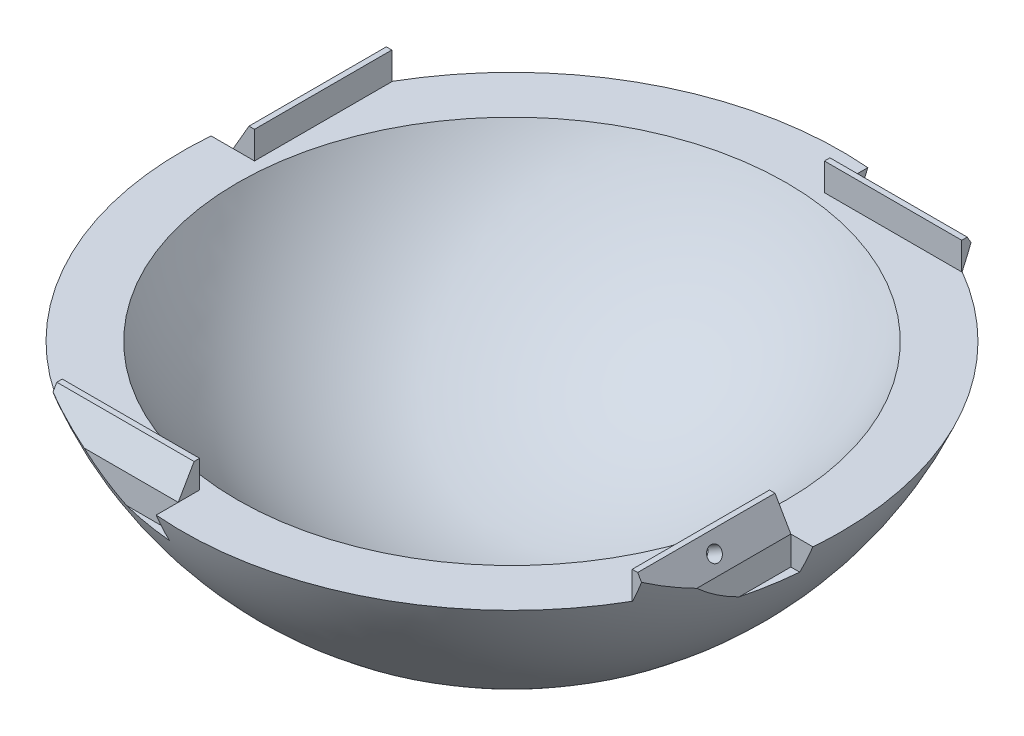
ISO-10303-21;
HEADER;
FILE_DESCRIPTION(('STEP AP214'),'2;1');
FILE_NAME('part.step','',(''),(''),'','','');
FILE_SCHEMA(('AUTOMOTIVE_DESIGN { 1 0 10303 214 1 1 1 1 }'));
ENDSEC;
DATA;
#1=APPLICATION_CONTEXT('core data for automotive mechanical design processes');
#2=APPLICATION_PROTOCOL_DEFINITION('international standard','automotive_design',2000,#1);
#3=PRODUCT_CONTEXT('',#1,'mechanical');
#4=PRODUCT('Part','Part','',(#3));
#5=PRODUCT_RELATED_PRODUCT_CATEGORY('part','',(#4));
#6=PRODUCT_DEFINITION_FORMATION('','',#4);
#7=PRODUCT_DEFINITION_CONTEXT('part definition',#1,'design');
#8=PRODUCT_DEFINITION('design','',#6,#7);
#9=PRODUCT_DEFINITION_SHAPE('','',#8);
#10=(LENGTH_UNIT() NAMED_UNIT(*) SI_UNIT(.MILLI.,.METRE.));
#11=(NAMED_UNIT(*) PLANE_ANGLE_UNIT() SI_UNIT($,.RADIAN.));
#12=(NAMED_UNIT(*) SI_UNIT($,.STERADIAN.) SOLID_ANGLE_UNIT());
#13=UNCERTAINTY_MEASURE_WITH_UNIT(LENGTH_MEASURE(1.E-05),#10,'distance_accuracy_value','');
#14=(GEOMETRIC_REPRESENTATION_CONTEXT(3) GLOBAL_UNCERTAINTY_ASSIGNED_CONTEXT((#13)) GLOBAL_UNIT_ASSIGNED_CONTEXT((#10,
#11,#12)) REPRESENTATION_CONTEXT('',''));
#15=CARTESIAN_POINT('',(0.,0.,0.));
#16=DIRECTION('',(0.,0.,1.));
#17=DIRECTION('',(1.,0.,0.));
#18=AXIS2_PLACEMENT_3D('',#15,#16,#17);
#19=CARTESIAN_POINT('',(0.,31.0836229548616,0.));
#20=DIRECTION('',(0.,1.,0.));
#21=DIRECTION('',(1.,0.,0.));
#22=AXIS2_PLACEMENT_3D('',#19,#20,#21);
#23=SPHERICAL_SURFACE('',#22,82.296);
#24=CARTESIAN_POINT('',(0.,0.,0.));
#25=DIRECTION('',(0.,1.,0.));
#26=DIRECTION('',(0.,0.,1.));
#27=AXIS2_PLACEMENT_3D('',#24,#25,#26);
#28=CIRCLE('',#27,76.2);
#29=CARTESIAN_POINT('',(-6.34999999999972,0.,75.9349557186939));
#30=VERTEX_POINT('',#29);
#31=CARTESIAN_POINT('',(65.9911357683742,0.,38.1));
#32=VERTEX_POINT('',#31);
#33=EDGE_CURVE('E413',#30,#32,#28,.T.);
#34=ORIENTED_EDGE('',*,*,#33,.F.);
#35=CARTESIAN_POINT('',(-6.34999999999998,31.0836229548616,0.));
#36=DIRECTION('',(-1.,0.,0.));
#37=DIRECTION('',(0.,0.,1.));
#38=AXIS2_PLACEMENT_3D('',#35,#36,#37);
#39=CIRCLE('',#38,82.0506496988293);
#40=CARTESIAN_POINT('',(-6.34999999999973,-6.604,72.8831406568912));
#41=VERTEX_POINT('',#40);
#42=EDGE_CURVE('E498',#30,#41,#39,.F.);
#43=ORIENTED_EDGE('',*,*,#42,.T.);
#44=CARTESIAN_POINT('',(0.,-6.604,0.));
#45=DIRECTION('',(0.,1.,0.));
#46=DIRECTION('',(0.,0.,1.));
#47=AXIS2_PLACEMENT_3D('',#44,#45,#46);
#48=CIRCLE('',#47,73.1592420136526);
#49=CARTESIAN_POINT('',(-18.3044560012823,-6.604,70.8323484187085));
#50=VERTEX_POINT('',#49);
#51=EDGE_CURVE('E495',#41,#50,#48,.F.);
#52=ORIENTED_EDGE('',*,*,#51,.T.);
#53=CARTESIAN_POINT('',(2.45406499722476E-13,31.0836229548616,70.8323484187084));
#54=DIRECTION('',(0.,0.,-1.));
#55=DIRECTION('',(-1.,0.,0.));
#56=AXIS2_PLACEMENT_3D('',#53,#54,#55);
#57=CIRCLE('',#56,41.8976136968528);
#58=CARTESIAN_POINT('',(-28.0930314756291,0.,70.8323484187085));
#59=VERTEX_POINT('',#58);
#60=EDGE_CURVE('E342',#59,#50,#57,.F.);
#61=ORIENTED_EDGE('',*,*,#60,.F.);
#62=CARTESIAN_POINT('',(1.36585089390929E-13,53.9840237863023,39.6646577537471));
#63=DIRECTION('',(0.,-0.500000000000006,-0.866025403784435));
#64=DIRECTION('',(0.,0.866025403784435,-0.500000000000006));
#65=AXIS2_PLACEMENT_3D('',#62,#63,#64);
#66=CIRCLE('',#65,68.3733733483837);
#67=CARTESIAN_POINT('',(-38.0999999999997,4.81613652969867,68.0517506968329));
#68=VERTEX_POINT('',#67);
#69=EDGE_CURVE('E437',#59,#68,#66,.T.);
#70=ORIENTED_EDGE('',*,*,#69,.T.);
#71=CARTESIAN_POINT('',(-38.1,31.0836229548616,1.33025439009923E-13));
#72=DIRECTION('',(-1.,0.,0.));
#73=DIRECTION('',(0.,0.,1.));
#74=AXIS2_PLACEMENT_3D('',#71,#72,#73);
#75=CIRCLE('',#74,72.9453330652483);
#76=CARTESIAN_POINT('',(-38.0999999999998,0.,65.9911357683744));
#77=VERTEX_POINT('',#76);
#78=EDGE_CURVE('E448',#77,#68,#75,.T.);
#79=ORIENTED_EDGE('',*,*,#78,.F.);
#80=CARTESIAN_POINT('',(-75.9349557186939,0.,-6.34999999999998));
#81=VERTEX_POINT('',#80);
#82=EDGE_CURVE('E409',#81,#77,#28,.T.);
#83=ORIENTED_EDGE('',*,*,#82,.F.);
#84=CARTESIAN_POINT('',(0.,31.0836229548616,-6.34999999999998));
#85=DIRECTION('',(0.,0.,-1.));
#86=DIRECTION('',(-1.,0.,0.));
#87=AXIS2_PLACEMENT_3D('',#84,#85,#86);
#88=CIRCLE('',#87,82.0506496988293);
#89=CARTESIAN_POINT('',(-72.8831406568912,-6.604,-6.34999999999998));
#90=VERTEX_POINT('',#89);
#91=EDGE_CURVE('E432',#81,#90,#88,.F.);
#92=ORIENTED_EDGE('',*,*,#91,.T.);
#93=CARTESIAN_POINT('',(0.,-6.604,0.));
#94=DIRECTION('',(0.,1.,0.));
#95=DIRECTION('',(0.,0.,1.));
#96=AXIS2_PLACEMENT_3D('',#93,#94,#95);
#97=CIRCLE('',#96,73.1592420136526);
#98=CARTESIAN_POINT('',(-70.8323484187084,-6.604,-18.3044560012825));
#99=VERTEX_POINT('',#98);
#100=EDGE_CURVE('E429',#90,#99,#97,.F.);
#101=ORIENTED_EDGE('',*,*,#100,.T.);
#102=CARTESIAN_POINT('',(-70.8323484187084,31.0836229548616,0.));
#103=DIRECTION('',(1.,0.,0.));
#104=DIRECTION('',(0.,0.,-1.));
#105=AXIS2_PLACEMENT_3D('',#102,#103,#104);
#106=CIRCLE('',#105,41.8976136968528);
#107=CARTESIAN_POINT('',(-70.8323484187084,0.,-28.0930314756293));
#108=VERTEX_POINT('',#107);
#109=EDGE_CURVE('E391',#108,#99,#106,.F.);
#110=ORIENTED_EDGE('',*,*,#109,.F.);
#111=CARTESIAN_POINT('',(-39.6646577537471,53.9840237863023,0.));
#112=DIRECTION('',(0.866025403784435,-0.500000000000006,0.));
#113=DIRECTION('',(0.500000000000006,0.866025403784435,0.));
#114=AXIS2_PLACEMENT_3D('',#111,#112,#113);
#115=CIRCLE('',#114,68.3733733483837);
#116=CARTESIAN_POINT('',(-68.0517506968328,4.81613652969867,-38.1));
#117=VERTEX_POINT('',#116);
#118=EDGE_CURVE('E415',#108,#117,#115,.T.);
#119=ORIENTED_EDGE('',*,*,#118,.T.);
#120=CARTESIAN_POINT('',(0.,31.0836229548616,-38.1));
#121=DIRECTION('',(0.,0.,-1.));
#122=DIRECTION('',(-1.,0.,0.));
#123=AXIS2_PLACEMENT_3D('',#120,#121,#122);
#124=CIRCLE('',#123,72.9453330652483);
#125=CARTESIAN_POINT('',(-65.9911357683742,0.,-38.1));
#126=VERTEX_POINT('',#125);
#127=EDGE_CURVE('E426',#126,#117,#124,.T.);
#128=ORIENTED_EDGE('',*,*,#127,.F.);
#129=CARTESIAN_POINT('',(6.34999999999919,0.,-75.934955718694));
#130=VERTEX_POINT('',#129);
#131=EDGE_CURVE('E408',#130,#126,#28,.T.);
#132=ORIENTED_EDGE('',*,*,#131,.F.);
#133=CARTESIAN_POINT('',(6.34999999999998,31.0836229548616,0.));
#134=DIRECTION('',(1.,0.,0.));
#135=DIRECTION('',(0.,0.,-1.));
#136=AXIS2_PLACEMENT_3D('',#133,#134,#135);
#137=CIRCLE('',#136,82.0506496988293);
#138=CARTESIAN_POINT('',(6.34999999999922,-6.604,-72.8831406568913));
#139=VERTEX_POINT('',#138);
#140=EDGE_CURVE('E486',#130,#139,#137,.F.);
#141=ORIENTED_EDGE('',*,*,#140,.T.);
#142=CARTESIAN_POINT('',(0.,-6.604,0.));
#143=DIRECTION('',(0.,1.,0.));
#144=DIRECTION('',(0.,0.,1.));
#145=AXIS2_PLACEMENT_3D('',#142,#143,#144);
#146=CIRCLE('',#145,73.1592420136526);
#147=CARTESIAN_POINT('',(18.3044560012818,-6.604,-70.8323484187086));
#148=VERTEX_POINT('',#147);
#149=EDGE_CURVE('E483',#139,#148,#146,.F.);
#150=ORIENTED_EDGE('',*,*,#149,.T.);
#151=CARTESIAN_POINT('',(-7.43832791038944E-13,31.0836229548616,-70.8323484187084));
#152=DIRECTION('',(0.,0.,1.));
#153=DIRECTION('',(1.,0.,0.));
#154=AXIS2_PLACEMENT_3D('',#151,#152,#153);
#155=CIRCLE('',#154,41.8976136968528);
#156=CARTESIAN_POINT('',(28.0930314756286,0.,-70.8323484187087));
#157=VERTEX_POINT('',#156);
#158=EDGE_CURVE('E316',#157,#148,#155,.F.);
#159=ORIENTED_EDGE('',*,*,#158,.F.);
#160=CARTESIAN_POINT('',(-4.17368560044302E-13,53.9840237863023,-39.6646577537471));
#161=DIRECTION('',(0.,-0.500000000000006,0.866025403784435));
#162=DIRECTION('',(0.,-0.866025403784435,-0.500000000000006));
#163=AXIS2_PLACEMENT_3D('',#160,#161,#162);
#164=CIRCLE('',#163,68.3733733483837);
#165=CARTESIAN_POINT('',(38.0999999999993,4.81613652969867,-68.0517506968332));
#166=VERTEX_POINT('',#165);
#167=EDGE_CURVE('E469',#157,#166,#164,.T.);
#168=ORIENTED_EDGE('',*,*,#167,.T.);
#169=CARTESIAN_POINT('',(38.1,31.0836229548616,-3.9907631702977E-13));
#170=DIRECTION('',(1.,0.,0.));
#171=DIRECTION('',(0.,0.,-1.));
#172=AXIS2_PLACEMENT_3D('',#169,#170,#171);
#173=CIRCLE('',#172,72.9453330652483);
#174=CARTESIAN_POINT('',(38.0999999999993,0.,-65.9911357683746));
#175=VERTEX_POINT('',#174);
#176=EDGE_CURVE('E480',#175,#166,#173,.T.);
#177=ORIENTED_EDGE('',*,*,#176,.F.);
#178=CARTESIAN_POINT('',(75.9349557186939,0.,6.34999999999998));
#179=VERTEX_POINT('',#178);
#180=EDGE_CURVE('E529',#179,#175,#28,.T.);
#181=ORIENTED_EDGE('',*,*,#180,.F.);
#182=CARTESIAN_POINT('',(0.,31.0836229548616,6.34999999999998));
#183=DIRECTION('',(0.,0.,1.));
#184=DIRECTION('',(1.,0.,0.));
#185=AXIS2_PLACEMENT_3D('',#182,#183,#184);
#186=CIRCLE('',#185,82.0506496988293);
#187=CARTESIAN_POINT('',(72.8831406568912,-6.604,6.34999999999998));
#188=VERTEX_POINT('',#187);
#189=EDGE_CURVE('E492',#179,#188,#186,.F.);
#190=ORIENTED_EDGE('',*,*,#189,.T.);
#191=CARTESIAN_POINT('',(0.,-6.604,0.));
#192=DIRECTION('',(0.,1.,0.));
#193=DIRECTION('',(0.,0.,1.));
#194=AXIS2_PLACEMENT_3D('',#191,#192,#193);
#195=CIRCLE('',#194,73.1592420136526);
#196=CARTESIAN_POINT('',(70.8323484187084,-6.604,18.3044560012825));
#197=VERTEX_POINT('',#196);
#198=EDGE_CURVE('E489',#188,#197,#195,.F.);
#199=ORIENTED_EDGE('',*,*,#198,.T.);
#200=CARTESIAN_POINT('',(70.8323484187084,31.0836229548616,0.));
#201=DIRECTION('',(-1.,0.,0.));
#202=DIRECTION('',(0.,0.,1.));
#203=AXIS2_PLACEMENT_3D('',#200,#201,#202);
#204=CIRCLE('',#203,41.8976136968528);
#205=CARTESIAN_POINT('',(70.8323484187084,0.,28.0930314756293));
#206=VERTEX_POINT('',#205);
#207=EDGE_CURVE('E340',#206,#197,#204,.F.);
#208=ORIENTED_EDGE('',*,*,#207,.F.);
#209=CARTESIAN_POINT('',(39.6646577537471,53.9840237863023,0.));
#210=DIRECTION('',(-0.866025403784435,-0.500000000000006,0.));
#211=DIRECTION('',(0.500000000000006,-0.866025403784435,0.));
#212=AXIS2_PLACEMENT_3D('',#209,#210,#211);
#213=CIRCLE('',#212,68.3733733483837);
#214=CARTESIAN_POINT('',(68.0517506968328,4.81613652969867,38.1));
#215=VERTEX_POINT('',#214);
#216=EDGE_CURVE('E453',#206,#215,#213,.T.);
#217=ORIENTED_EDGE('',*,*,#216,.T.);
#218=CARTESIAN_POINT('',(0.,31.0836229548616,38.1));
#219=DIRECTION('',(0.,0.,1.));
#220=DIRECTION('',(1.,0.,0.));
#221=AXIS2_PLACEMENT_3D('',#218,#219,#220);
#222=CIRCLE('',#221,72.9453330652483);
#223=EDGE_CURVE('E464',#32,#215,#222,.T.);
#224=ORIENTED_EDGE('',*,*,#223,.F.);
#225=EDGE_LOOP('',(#34,#43,#52,#61,#70,#79,#83,#92,#101,#110,#119,#128,#132,#141,#150,#159,#168,
#177,#181,#190,#199,#208,#217,#224));
#226=FACE_BOUND('',#225,.T.);
#227=ADVANCED_FACE('F49',(#226),#23,.T.);
#228=CARTESIAN_POINT('',(0.,0.,0.));
#229=DIRECTION('',(0.,1.,0.));
#230=DIRECTION('',(0.,0.,1.));
#231=AXIS2_PLACEMENT_3D('',#228,#229,#230);
#232=PLANE('',#231);
#233=CARTESIAN_POINT('',(63.6951351320818,0.,22.225));
#234=DIRECTION('',(0.,1.,0.));
#235=DIRECTION('',(1.,0.,0.));
#236=AXIS2_PLACEMENT_3D('',#233,#234,#235);
#237=ELLIPSE('',#236,3.27659999999995,1.6383);
#238=CARTESIAN_POINT('',(63.2067060632518,0.,23.8449957256673));
#239=VERTEX_POINT('',#238);
#240=CARTESIAN_POINT('',(65.8961742093549,0.,23.4386241737372));
#241=VERTEX_POINT('',#240);
#242=EDGE_CURVE('E65',#239,#241,#237,.T.);
#243=ORIENTED_EDGE('',*,*,#242,.F.);
#244=DIRECTION('',(0.,0.,-1.));
#245=VECTOR('',#244,1.);
#246=CARTESIAN_POINT('',(63.2067060632518,0.,0.));
#247=LINE('',#246,#245);
#248=CARTESIAN_POINT('',(63.2067060632518,0.,20.6050042743326));
#249=VERTEX_POINT('',#248);
#250=EDGE_CURVE('E12',#239,#249,#247,.T.);
#251=ORIENTED_EDGE('',*,*,#250,.T.);
#252=CARTESIAN_POINT('',(65.8961742093548,0.,21.0113758262628));
#253=VERTEX_POINT('',#252);
#254=EDGE_CURVE('E253',#253,#249,#237,.T.);
#255=ORIENTED_EDGE('',*,*,#254,.F.);
#256=DIRECTION('',(0.,0.,-1.));
#257=VECTOR('',#256,1.);
#258=CARTESIAN_POINT('',(65.8961742093546,0.,-6.90225787659354E-13));
#259=LINE('',#258,#257);
#260=CARTESIAN_POINT('',(65.8961742093547,0.,6.3499999999986));
#261=VERTEX_POINT('',#260);
#262=EDGE_CURVE('E263',#253,#261,#259,.T.);
#263=ORIENTED_EDGE('',*,*,#262,.T.);
#264=DIRECTION('',(-1.,0.,0.));
#265=VECTOR('',#264,1.);
#266=CARTESIAN_POINT('',(0.,0.,6.34999999999998));
#267=LINE('',#266,#265);
#268=CARTESIAN_POINT('',(70.8323484187084,0.,6.34999999999998));
#269=VERTEX_POINT('',#268);
#270=EDGE_CURVE('E352',#269,#261,#267,.T.);
#271=ORIENTED_EDGE('',*,*,#270,.F.);
#272=DIRECTION('',(1.,0.,0.));
#273=VECTOR('',#272,1.);
#274=CARTESIAN_POINT('',(0.,0.,6.34999999999998));
#275=LINE('',#274,#273);
#276=EDGE_CURVE('E321',#269,#179,#275,.T.);
#277=ORIENTED_EDGE('',*,*,#276,.T.);
#278=ORIENTED_EDGE('',*,*,#180,.T.);
#279=DIRECTION('',(0.,0.,1.));
#280=VECTOR('',#279,1.);
#281=CARTESIAN_POINT('',(38.1,0.,-3.9907631702977E-13));
#282=LINE('',#281,#280);
#283=CARTESIAN_POINT('',(38.0999999999993,0.,-65.8961742093546));
#284=VERTEX_POINT('',#283);
#285=EDGE_CURVE('E349',#175,#284,#282,.T.);
#286=ORIENTED_EDGE('',*,*,#285,.T.);
#287=DIRECTION('',(-1.,0.,0.));
#288=VECTOR('',#287,1.);
#289=CARTESIAN_POINT('',(0.,0.,-65.8961742093546));
#290=LINE('',#289,#288);
#291=CARTESIAN_POINT('',(6.34999999999929,0.,-65.8961742093546));
#292=VERTEX_POINT('',#291);
#293=EDGE_CURVE('E293',#284,#292,#290,.T.);
#294=ORIENTED_EDGE('',*,*,#293,.T.);
#295=DIRECTION('',(0.,0.,1.));
#296=VECTOR('',#295,1.);
#297=CARTESIAN_POINT('',(6.34999999999998,0.,0.));
#298=LINE('',#297,#296);
#299=CARTESIAN_POINT('',(6.34999999999924,0.,-70.8323484187085));
#300=VERTEX_POINT('',#299);
#301=EDGE_CURVE('E344',#300,#292,#298,.T.);
#302=ORIENTED_EDGE('',*,*,#301,.F.);
#303=DIRECTION('',(0.,0.,-1.));
#304=VECTOR('',#303,1.);
#305=CARTESIAN_POINT('',(6.34999999999998,0.,0.));
#306=LINE('',#305,#304);
#307=EDGE_CURVE('E301',#300,#130,#306,.T.);
#308=ORIENTED_EDGE('',*,*,#307,.T.);
#309=ORIENTED_EDGE('',*,*,#131,.T.);
#310=DIRECTION('',(1.,0.,0.));
#311=VECTOR('',#310,1.);
#312=CARTESIAN_POINT('',(0.,0.,-38.1));
#313=LINE('',#312,#311);
#314=CARTESIAN_POINT('',(-65.8961742093548,0.,-38.0999999999991));
#315=VERTEX_POINT('',#314);
#316=EDGE_CURVE('E398',#126,#315,#313,.T.);
#317=ORIENTED_EDGE('',*,*,#316,.T.);
#318=DIRECTION('',(0.,0.,1.));
#319=VECTOR('',#318,1.);
#320=CARTESIAN_POINT('',(-65.8961742093546,0.,2.30075262553118E-13));
#321=LINE('',#320,#319);
#322=CARTESIAN_POINT('',(-65.8961742093546,0.,-6.34999999999906));
#323=VERTEX_POINT('',#322);
#324=EDGE_CURVE('E267',#315,#323,#321,.T.);
#325=ORIENTED_EDGE('',*,*,#324,.T.);
#326=DIRECTION('',(1.,0.,0.));
#327=VECTOR('',#326,1.);
#328=CARTESIAN_POINT('',(0.,0.,-6.34999999999998));
#329=LINE('',#328,#327);
#330=CARTESIAN_POINT('',(-70.8323484187084,0.,-6.34999999999998));
#331=VERTEX_POINT('',#330);
#332=EDGE_CURVE('E393',#331,#323,#329,.T.);
#333=ORIENTED_EDGE('',*,*,#332,.F.);
#334=DIRECTION('',(-1.,0.,0.));
#335=VECTOR('',#334,1.);
#336=CARTESIAN_POINT('',(0.,0.,-6.34999999999998));
#337=LINE('',#336,#335);
#338=EDGE_CURVE('E375',#331,#81,#337,.T.);
#339=ORIENTED_EDGE('',*,*,#338,.T.);
#340=ORIENTED_EDGE('',*,*,#82,.T.);
#341=DIRECTION('',(0.,0.,-1.));
#342=VECTOR('',#341,1.);
#343=CARTESIAN_POINT('',(-38.1,0.,1.33025439009923E-13));
#344=LINE('',#343,#342);
#345=CARTESIAN_POINT('',(-38.0999999999993,0.,65.8961742093546));
#346=VERTEX_POINT('',#345);
#347=EDGE_CURVE('E372',#77,#346,#344,.T.);
#348=ORIENTED_EDGE('',*,*,#347,.T.);
#349=DIRECTION('',(1.,0.,0.));
#350=VECTOR('',#349,1.);
#351=CARTESIAN_POINT('',(0.,0.,65.8961742093546));
#352=LINE('',#351,#350);
#353=CARTESIAN_POINT('',(-6.34999999999929,0.,65.8961742093546));
#354=VERTEX_POINT('',#353);
#355=EDGE_CURVE('E278',#346,#354,#352,.T.);
#356=ORIENTED_EDGE('',*,*,#355,.T.);
#357=DIRECTION('',(0.,0.,-1.));
#358=VECTOR('',#357,1.);
#359=CARTESIAN_POINT('',(-6.34999999999998,0.,0.));
#360=LINE('',#359,#358);
#361=CARTESIAN_POINT('',(-6.34999999999973,0.,70.8323484187084));
#362=VERTEX_POINT('',#361);
#363=EDGE_CURVE('E364',#362,#354,#360,.T.);
#364=ORIENTED_EDGE('',*,*,#363,.F.);
#365=DIRECTION('',(0.,0.,1.));
#366=VECTOR('',#365,1.);
#367=CARTESIAN_POINT('',(-6.34999999999998,0.,0.));
#368=LINE('',#367,#366);
#369=EDGE_CURVE('E307',#362,#30,#368,.T.);
#370=ORIENTED_EDGE('',*,*,#369,.T.);
#371=ORIENTED_EDGE('',*,*,#33,.T.);
#372=DIRECTION('',(-1.,0.,0.));
#373=VECTOR('',#372,1.);
#374=CARTESIAN_POINT('',(0.,0.,38.1));
#375=LINE('',#374,#373);
#376=CARTESIAN_POINT('',(65.896174209355,0.,38.0999999999986));
#377=VERTEX_POINT('',#376);
#378=EDGE_CURVE('E361',#32,#377,#375,.T.);
#379=ORIENTED_EDGE('',*,*,#378,.T.);
#380=EDGE_CURVE('E260',#377,#241,#259,.T.);
#381=ORIENTED_EDGE('',*,*,#380,.T.);
#382=EDGE_LOOP('',(#243,#251,#255,#263,#271,#277,#278,#286,#294,#302,#308,#309,#317,#325,#333,
#339,#340,#348,#356,#364,#370,#371,#379,#381));
#383=FACE_BOUND('',#382,.T.);
#384=CARTESIAN_POINT('',(0.,0.,0.));
#385=DIRECTION('',(0.,1.,0.));
#386=DIRECTION('',(0.,0.,1.));
#387=AXIS2_PLACEMENT_3D('',#384,#385,#386);
#388=CIRCLE('',#387,63.5);
#389=CARTESIAN_POINT('',(0.,0.,63.5));
#390=VERTEX_POINT('',#389);
#391=EDGE_CURVE('E401',#390,#390,#388,.T.);
#392=ORIENTED_EDGE('',*,*,#391,.F.);
#393=EDGE_LOOP('',(#392));
#394=FACE_BOUND('',#393,.T.);
#395=ADVANCED_FACE('F257',(#383,#394),#232,.T.);
#396=CARTESIAN_POINT('',(0.,33.6883586468427,0.));
#397=DIRECTION('',(0.,1.,0.));
#398=DIRECTION('',(1.,0.,0.));
#399=AXIS2_PLACEMENT_3D('',#396,#397,#398);
#400=SPHERICAL_SURFACE('',#399,71.8829291857135);
#401=ORIENTED_EDGE('',*,*,#391,.T.);
#402=EDGE_LOOP('',(#401));
#403=FACE_BOUND('',#402,.T.);
#404=ADVANCED_FACE('F602',(#403),#400,.F.);
#405=CARTESIAN_POINT('',(0.,6.35,-6.34999999999998));
#406=DIRECTION('',(0.,0.,-1.));
#407=DIRECTION('',(-1.,0.,0.));
#408=AXIS2_PLACEMENT_3D('',#405,#406,#407);
#409=PLANE('',#408);
#410=ORIENTED_EDGE('',*,*,#332,.T.);
#411=DIRECTION('',(0.,1.,0.));
#412=VECTOR('',#411,1.);
#413=CARTESIAN_POINT('',(-65.8961742093546,0.,-6.34999999999906));
#414=LINE('',#413,#412);
#415=CARTESIAN_POINT('',(-65.8961742093546,6.35,-6.34999999999906));
#416=VERTEX_POINT('',#415);
#417=EDGE_CURVE('E273',#323,#416,#414,.T.);
#418=ORIENTED_EDGE('',*,*,#417,.T.);
#419=DIRECTION('',(1.,0.,0.));
#420=VECTOR('',#419,1.);
#421=CARTESIAN_POINT('',(0.,6.35,-6.34999999999998));
#422=LINE('',#421,#420);
#423=CARTESIAN_POINT('',(-67.1661742093542,6.35,-6.34999999999998));
#424=VERTEX_POINT('',#423);
#425=EDGE_CURVE('E394',#424,#416,#422,.T.);
#426=ORIENTED_EDGE('',*,*,#425,.F.);
#427=DIRECTION('',(-0.500000000000006,-0.866025403784435,0.));
#428=VECTOR('',#427,1.);
#429=CARTESIAN_POINT('',(-50.3746306570153,35.4338065701562,-6.34999999999998));
#430=LINE('',#429,#428);
#431=EDGE_CURVE('E423',#424,#331,#430,.T.);
#432=ORIENTED_EDGE('',*,*,#431,.T.);
#433=EDGE_LOOP('',(#410,#418,#426,#432));
#434=FACE_BOUND('',#433,.T.);
#435=ADVANCED_FACE('F550',(#434),#409,.F.);
#436=CARTESIAN_POINT('',(0.,6.35,-38.1));
#437=DIRECTION('',(0.,0.,-1.));
#438=DIRECTION('',(-1.,0.,0.));
#439=AXIS2_PLACEMENT_3D('',#436,#437,#438);
#440=PLANE('',#439);
#441=DIRECTION('',(0.,1.,0.));
#442=VECTOR('',#441,1.);
#443=CARTESIAN_POINT('',(-65.8961742093548,0.,-38.0999999999991));
#444=LINE('',#443,#442);
#445=CARTESIAN_POINT('',(-65.8961742093547,6.35,-38.1));
#446=VERTEX_POINT('',#445);
#447=EDGE_CURVE('E73',#315,#446,#444,.T.);
#448=ORIENTED_EDGE('',*,*,#447,.F.);
#449=ORIENTED_EDGE('',*,*,#316,.F.);
#450=ORIENTED_EDGE('',*,*,#127,.T.);
#451=DIRECTION('',(0.500000000000006,0.866025403784435,0.));
#452=VECTOR('',#451,1.);
#453=CARTESIAN_POINT('',(-70.8323484187084,0.,-38.1));
#454=LINE('',#453,#452);
#455=CARTESIAN_POINT('',(-67.1661742093542,6.35,-38.1));
#456=VERTEX_POINT('',#455);
#457=EDGE_CURVE('E417',#117,#456,#454,.T.);
#458=ORIENTED_EDGE('',*,*,#457,.T.);
#459=DIRECTION('',(1.,0.,0.));
#460=VECTOR('',#459,1.);
#461=CARTESIAN_POINT('',(0.,6.35,-38.1));
#462=LINE('',#461,#460);
#463=EDGE_CURVE('E397',#456,#446,#462,.T.);
#464=ORIENTED_EDGE('',*,*,#463,.T.);
#465=EDGE_LOOP('',(#448,#449,#450,#458,#464));
#466=FACE_BOUND('',#465,.T.);
#467=ADVANCED_FACE('F537',(#466),#440,.T.);
#468=CARTESIAN_POINT('',(0.,6.35,0.));
#469=DIRECTION('',(0.,1.,0.));
#470=DIRECTION('',(0.,0.,1.));
#471=AXIS2_PLACEMENT_3D('',#468,#469,#470);
#472=PLANE('',#471);
#473=DIRECTION('',(0.,0.,1.));
#474=VECTOR('',#473,1.);
#475=CARTESIAN_POINT('',(-65.8961742093546,6.35,2.30075262553118E-13));
#476=LINE('',#475,#474);
#477=EDGE_CURVE('E270',#446,#416,#476,.T.);
#478=ORIENTED_EDGE('',*,*,#477,.F.);
#479=ORIENTED_EDGE('',*,*,#463,.F.);
#480=DIRECTION('',(0.,0.,1.));
#481=VECTOR('',#480,1.);
#482=CARTESIAN_POINT('',(-67.1661742093542,6.35,0.));
#483=LINE('',#482,#481);
#484=EDGE_CURVE('E420',#456,#424,#483,.T.);
#485=ORIENTED_EDGE('',*,*,#484,.T.);
#486=ORIENTED_EDGE('',*,*,#425,.T.);
#487=EDGE_LOOP('',(#478,#479,#485,#486));
#488=FACE_BOUND('',#487,.T.);
#489=ADVANCED_FACE('F547',(#488),#472,.T.);
#490=CARTESIAN_POINT('',(-70.8323484187084,0.,0.));
#491=DIRECTION('',(0.866025403784435,-0.500000000000006,0.));
#492=DIRECTION('',(0.,0.,-1.));
#493=AXIS2_PLACEMENT_3D('',#490,#491,#492);
#494=PLANE('',#493);
#495=ORIENTED_EDGE('',*,*,#431,.F.);
#496=ORIENTED_EDGE('',*,*,#484,.F.);
#497=ORIENTED_EDGE('',*,*,#457,.F.);
#498=ORIENTED_EDGE('',*,*,#118,.F.);
#499=DIRECTION('',(0.,0.,-1.));
#500=VECTOR('',#499,1.);
#501=CARTESIAN_POINT('',(-70.8323484187084,0.,0.));
#502=LINE('',#501,#500);
#503=EDGE_CURVE('E412',#331,#108,#502,.T.);
#504=ORIENTED_EDGE('',*,*,#503,.F.);
#505=EDGE_LOOP('',(#495,#496,#497,#498,#504));
#506=FACE_BOUND('',#505,.T.);
#507=ADVANCED_FACE('F544',(#506),#494,.F.);
#508=CARTESIAN_POINT('',(0.,-6.604,-6.34999999999998));
#509=DIRECTION('',(0.,0.,-1.));
#510=DIRECTION('',(-1.,0.,0.));
#511=AXIS2_PLACEMENT_3D('',#508,#509,#510);
#512=PLANE('',#511);
#513=ORIENTED_EDGE('',*,*,#338,.F.);
#514=DIRECTION('',(0.,1.,0.));
#515=VECTOR('',#514,1.);
#516=CARTESIAN_POINT('',(-70.8323484187084,-6.604,-6.34999999999998));
#517=LINE('',#516,#515);
#518=CARTESIAN_POINT('',(-70.8323484187084,-6.604,-6.34999999999998));
#519=VERTEX_POINT('',#518);
#520=EDGE_CURVE('E386',#519,#331,#517,.T.);
#521=ORIENTED_EDGE('',*,*,#520,.F.);
#522=DIRECTION('',(-1.,0.,0.));
#523=VECTOR('',#522,1.);
#524=CARTESIAN_POINT('',(0.,-6.604,-6.34999999999998));
#525=LINE('',#524,#523);
#526=EDGE_CURVE('E380',#519,#90,#525,.T.);
#527=ORIENTED_EDGE('',*,*,#526,.T.);
#528=ORIENTED_EDGE('',*,*,#91,.F.);
#529=EDGE_LOOP('',(#513,#521,#527,#528));
#530=FACE_BOUND('',#529,.T.);
#531=ADVANCED_FACE('F615',(#530),#512,.T.);
#532=CARTESIAN_POINT('',(-70.8323484187084,-6.604,0.));
#533=DIRECTION('',(1.,0.,0.));
#534=DIRECTION('',(0.,0.,-1.));
#535=AXIS2_PLACEMENT_3D('',#532,#533,#534);
#536=PLANE('',#535);
#537=ORIENTED_EDGE('',*,*,#109,.T.);
#538=DIRECTION('',(0.,0.,-1.));
#539=VECTOR('',#538,1.);
#540=CARTESIAN_POINT('',(-70.8323484187084,-6.604,0.));
#541=LINE('',#540,#539);
#542=EDGE_CURVE('E383',#519,#99,#541,.T.);
#543=ORIENTED_EDGE('',*,*,#542,.F.);
#544=ORIENTED_EDGE('',*,*,#520,.T.);
#545=ORIENTED_EDGE('',*,*,#503,.T.);
#546=EDGE_LOOP('',(#537,#543,#544,#545));
#547=FACE_BOUND('',#546,.T.);
#548=ADVANCED_FACE('F974',(#547),#536,.F.);
#549=CARTESIAN_POINT('',(0.,-6.604,0.));
#550=DIRECTION('',(0.,1.,0.));
#551=DIRECTION('',(0.,0.,1.));
#552=AXIS2_PLACEMENT_3D('',#549,#550,#551);
#553=PLANE('',#552);
#554=ORIENTED_EDGE('',*,*,#526,.F.);
#555=ORIENTED_EDGE('',*,*,#542,.T.);
#556=ORIENTED_EDGE('',*,*,#100,.F.);
#557=EDGE_LOOP('',(#554,#555,#556));
#558=FACE_BOUND('',#557,.T.);
#559=ADVANCED_FACE('F875',(#558),#553,.T.);
#560=CARTESIAN_POINT('',(-6.34999999999998,6.35,0.));
#561=DIRECTION('',(-1.,0.,0.));
#562=DIRECTION('',(0.,0.,1.));
#563=AXIS2_PLACEMENT_3D('',#560,#561,#562);
#564=PLANE('',#563);
#565=ORIENTED_EDGE('',*,*,#363,.T.);
#566=DIRECTION('',(0.,1.,0.));
#567=VECTOR('',#566,1.);
#568=CARTESIAN_POINT('',(-6.34999999999929,0.,65.8961742093546));
#569=LINE('',#568,#567);
#570=CARTESIAN_POINT('',(-6.34999999999929,6.35,65.8961742093546));
#571=VERTEX_POINT('',#570);
#572=EDGE_CURVE('E272',#354,#571,#569,.T.);
#573=ORIENTED_EDGE('',*,*,#572,.T.);
#574=DIRECTION('',(0.,0.,-1.));
#575=VECTOR('',#574,1.);
#576=CARTESIAN_POINT('',(-6.34999999999998,6.35,0.));
#577=LINE('',#576,#575);
#578=CARTESIAN_POINT('',(-6.34999999999975,6.35,67.1661742093542));
#579=VERTEX_POINT('',#578);
#580=EDGE_CURVE('E368',#579,#571,#577,.T.);
#581=ORIENTED_EDGE('',*,*,#580,.F.);
#582=DIRECTION('',(0.,-0.866025403784435,0.500000000000006));
#583=VECTOR('',#582,1.);
#584=CARTESIAN_POINT('',(-6.3499999999998,35.4338065701562,50.3746306570153));
#585=LINE('',#584,#583);
#586=EDGE_CURVE('E445',#579,#362,#585,.T.);
#587=ORIENTED_EDGE('',*,*,#586,.T.);
#588=EDGE_LOOP('',(#565,#573,#581,#587));
#589=FACE_BOUND('',#588,.T.);
#590=ADVANCED_FACE('F572',(#589),#564,.F.);
#591=CARTESIAN_POINT('',(-38.1,6.35,1.33025439009923E-13));
#592=DIRECTION('',(-1.,0.,0.));
#593=DIRECTION('',(0.,0.,1.));
#594=AXIS2_PLACEMENT_3D('',#591,#592,#593);
#595=PLANE('',#594);
#596=DIRECTION('',(0.,1.,0.));
#597=VECTOR('',#596,1.);
#598=CARTESIAN_POINT('',(-38.0999999999993,0.,65.8961742093546));
#599=LINE('',#598,#597);
#600=CARTESIAN_POINT('',(-38.0999999999998,6.35,65.8961742093546));
#601=VERTEX_POINT('',#600);
#602=EDGE_CURVE('E281',#346,#601,#599,.T.);
#603=ORIENTED_EDGE('',*,*,#602,.F.);
#604=ORIENTED_EDGE('',*,*,#347,.F.);
#605=ORIENTED_EDGE('',*,*,#78,.T.);
#606=DIRECTION('',(0.,0.866025403784435,-0.500000000000006));
#607=VECTOR('',#606,1.);
#608=CARTESIAN_POINT('',(-38.0999999999997,0.,70.8323484187085));
#609=LINE('',#608,#607);
#610=CARTESIAN_POINT('',(-38.0999999999997,6.35,67.1661742093544));
#611=VERTEX_POINT('',#610);
#612=EDGE_CURVE('E439',#68,#611,#609,.T.);
#613=ORIENTED_EDGE('',*,*,#612,.T.);
#614=DIRECTION('',(0.,0.,-1.));
#615=VECTOR('',#614,1.);
#616=CARTESIAN_POINT('',(-38.1,6.35,1.33025439009923E-13));
#617=LINE('',#616,#615);
#618=EDGE_CURVE('E371',#611,#601,#617,.T.);
#619=ORIENTED_EDGE('',*,*,#618,.T.);
#620=EDGE_LOOP('',(#603,#604,#605,#613,#619));
#621=FACE_BOUND('',#620,.T.);
#622=ADVANCED_FACE('F560',(#621),#595,.T.);
#623=CARTESIAN_POINT('',(0.,6.35,0.));
#624=DIRECTION('',(0.,1.,0.));
#625=DIRECTION('',(1.,0.,0.));
#626=AXIS2_PLACEMENT_3D('',#623,#624,#625);
#627=PLANE('',#626);
#628=DIRECTION('',(1.,0.,0.));
#629=VECTOR('',#628,1.);
#630=CARTESIAN_POINT('',(0.,6.35,65.8961742093546));
#631=LINE('',#630,#629);
#632=EDGE_CURVE('E282',#601,#571,#631,.T.);
#633=ORIENTED_EDGE('',*,*,#632,.F.);
#634=ORIENTED_EDGE('',*,*,#618,.F.);
#635=DIRECTION('',(1.,0.,0.));
#636=VECTOR('',#635,1.);
#637=CARTESIAN_POINT('',(2.34509443853447E-13,6.35,67.1661742093542));
#638=LINE('',#637,#636);
#639=EDGE_CURVE('E442',#611,#579,#638,.T.);
#640=ORIENTED_EDGE('',*,*,#639,.T.);
#641=ORIENTED_EDGE('',*,*,#580,.T.);
#642=EDGE_LOOP('',(#633,#634,#640,#641));
#643=FACE_BOUND('',#642,.T.);
#644=ADVANCED_FACE('F568',(#643),#627,.T.);
#645=CARTESIAN_POINT('',(0.,6.35,6.34999999999998));
#646=DIRECTION('',(0.,0.,1.));
#647=DIRECTION('',(1.,0.,0.));
#648=AXIS2_PLACEMENT_3D('',#645,#646,#647);
#649=PLANE('',#648);
#650=ORIENTED_EDGE('',*,*,#270,.T.);
#651=DIRECTION('',(0.,1.,0.));
#652=VECTOR('',#651,1.);
#653=CARTESIAN_POINT('',(65.8961742093547,0.,6.3499999999986));
#654=LINE('',#653,#652);
#655=CARTESIAN_POINT('',(65.8961742093547,6.35,6.3499999999986));
#656=VERTEX_POINT('',#655);
#657=EDGE_CURVE('E284',#261,#656,#654,.T.);
#658=ORIENTED_EDGE('',*,*,#657,.T.);
#659=DIRECTION('',(-1.,0.,0.));
#660=VECTOR('',#659,1.);
#661=CARTESIAN_POINT('',(0.,6.35,6.34999999999998));
#662=LINE('',#661,#660);
#663=CARTESIAN_POINT('',(67.1661742093542,6.35,6.34999999999998));
#664=VERTEX_POINT('',#663);
#665=EDGE_CURVE('E357',#664,#656,#662,.T.);
#666=ORIENTED_EDGE('',*,*,#665,.F.);
#667=DIRECTION('',(0.500000000000006,-0.866025403784435,0.));
#668=VECTOR('',#667,1.);
#669=CARTESIAN_POINT('',(50.3746306570153,35.4338065701562,6.34999999999998));
#670=LINE('',#669,#668);
#671=EDGE_CURVE('E461',#664,#269,#670,.T.);
#672=ORIENTED_EDGE('',*,*,#671,.T.);
#673=EDGE_LOOP('',(#650,#658,#666,#672));
#674=FACE_BOUND('',#673,.T.);
#675=ADVANCED_FACE('F508',(#674),#649,.F.);
#676=CARTESIAN_POINT('',(0.,6.35,38.1));
#677=DIRECTION('',(0.,0.,1.));
#678=DIRECTION('',(1.,0.,0.));
#679=AXIS2_PLACEMENT_3D('',#676,#677,#678);
#680=PLANE('',#679);
#681=DIRECTION('',(0.,1.,0.));
#682=VECTOR('',#681,1.);
#683=CARTESIAN_POINT('',(65.896174209355,0.,38.0999999999986));
#684=LINE('',#683,#682);
#685=CARTESIAN_POINT('',(65.8961742093549,6.35,38.1));
#686=VERTEX_POINT('',#685);
#687=EDGE_CURVE('E288',#377,#686,#684,.T.);
#688=ORIENTED_EDGE('',*,*,#687,.F.);
#689=ORIENTED_EDGE('',*,*,#378,.F.);
#690=ORIENTED_EDGE('',*,*,#223,.T.);
#691=DIRECTION('',(-0.500000000000006,0.866025403784435,0.));
#692=VECTOR('',#691,1.);
#693=CARTESIAN_POINT('',(70.8323484187084,0.,38.1));
#694=LINE('',#693,#692);
#695=CARTESIAN_POINT('',(67.1661742093542,6.35,38.1));
#696=VERTEX_POINT('',#695);
#697=EDGE_CURVE('E455',#215,#696,#694,.T.);
#698=ORIENTED_EDGE('',*,*,#697,.T.);
#699=DIRECTION('',(-1.,0.,0.));
#700=VECTOR('',#699,1.);
#701=CARTESIAN_POINT('',(0.,6.35,38.1));
#702=LINE('',#701,#700);
#703=EDGE_CURVE('E360',#696,#686,#702,.T.);
#704=ORIENTED_EDGE('',*,*,#703,.T.);
#705=EDGE_LOOP('',(#688,#689,#690,#698,#704));
#706=FACE_BOUND('',#705,.T.);
#707=ADVANCED_FACE('F583',(#706),#680,.T.);
#708=CARTESIAN_POINT('',(0.,6.35,0.));
#709=DIRECTION('',(0.,1.,0.));
#710=DIRECTION('',(0.,0.,-1.));
#711=AXIS2_PLACEMENT_3D('',#708,#709,#710);
#712=PLANE('',#711);
#713=DIRECTION('',(0.,0.,-1.));
#714=VECTOR('',#713,1.);
#715=CARTESIAN_POINT('',(65.8961742093546,6.35,-6.90225787659354E-13));
#716=LINE('',#715,#714);
#717=EDGE_CURVE('E261',#686,#656,#716,.T.);
#718=ORIENTED_EDGE('',*,*,#717,.F.);
#719=ORIENTED_EDGE('',*,*,#703,.F.);
#720=DIRECTION('',(0.,0.,-1.));
#721=VECTOR('',#720,1.);
#722=CARTESIAN_POINT('',(67.1661742093542,6.35,0.));
#723=LINE('',#722,#721);
#724=EDGE_CURVE('E458',#696,#664,#723,.T.);
#725=ORIENTED_EDGE('',*,*,#724,.T.);
#726=ORIENTED_EDGE('',*,*,#665,.T.);
#727=EDGE_LOOP('',(#718,#719,#725,#726));
#728=FACE_BOUND('',#727,.T.);
#729=ADVANCED_FACE('F585',(#728),#712,.T.);
#730=CARTESIAN_POINT('',(6.34999999999998,6.35,0.));
#731=DIRECTION('',(1.,0.,0.));
#732=DIRECTION('',(0.,0.,-1.));
#733=AXIS2_PLACEMENT_3D('',#730,#731,#732);
#734=PLANE('',#733);
#735=ORIENTED_EDGE('',*,*,#301,.T.);
#736=DIRECTION('',(0.,1.,0.));
#737=VECTOR('',#736,1.);
#738=CARTESIAN_POINT('',(6.34999999999929,0.,-65.8961742093546));
#739=LINE('',#738,#737);
#740=CARTESIAN_POINT('',(6.34999999999929,6.35,-65.8961742093546));
#741=VERTEX_POINT('',#740);
#742=EDGE_CURVE('E298',#292,#741,#739,.T.);
#743=ORIENTED_EDGE('',*,*,#742,.T.);
#744=DIRECTION('',(0.,0.,1.));
#745=VECTOR('',#744,1.);
#746=CARTESIAN_POINT('',(6.34999999999998,6.35,0.));
#747=LINE('',#746,#745);
#748=CARTESIAN_POINT('',(6.34999999999928,6.35,-67.1661742093543));
#749=VERTEX_POINT('',#748);
#750=EDGE_CURVE('E345',#749,#741,#747,.T.);
#751=ORIENTED_EDGE('',*,*,#750,.F.);
#752=DIRECTION('',(0.,-0.866025403784435,-0.500000000000006));
#753=VECTOR('',#752,1.);
#754=CARTESIAN_POINT('',(6.34999999999945,35.4338065701562,-50.3746306570153));
#755=LINE('',#754,#753);
#756=EDGE_CURVE('E477',#749,#300,#755,.T.);
#757=ORIENTED_EDGE('',*,*,#756,.T.);
#758=EDGE_LOOP('',(#735,#743,#751,#757));
#759=FACE_BOUND('',#758,.T.);
#760=ADVANCED_FACE('F587',(#759),#734,.F.);
#761=CARTESIAN_POINT('',(38.1,6.35,-3.9907631702977E-13));
#762=DIRECTION('',(1.,0.,0.));
#763=DIRECTION('',(0.,0.,-1.));
#764=AXIS2_PLACEMENT_3D('',#761,#762,#763);
#765=PLANE('',#764);
#766=DIRECTION('',(0.,1.,0.));
#767=VECTOR('',#766,1.);
#768=CARTESIAN_POINT('',(38.0999999999993,0.,-65.8961742093546));
#769=LINE('',#768,#767);
#770=CARTESIAN_POINT('',(38.0999999999993,6.35,-65.8961742093546));
#771=VERTEX_POINT('',#770);
#772=EDGE_CURVE('E296',#284,#771,#769,.T.);
#773=ORIENTED_EDGE('',*,*,#772,.F.);
#774=ORIENTED_EDGE('',*,*,#285,.F.);
#775=ORIENTED_EDGE('',*,*,#176,.T.);
#776=DIRECTION('',(0.,0.866025403784435,0.500000000000006));
#777=VECTOR('',#776,1.);
#778=CARTESIAN_POINT('',(38.0999999999992,0.,-70.8323484187088));
#779=LINE('',#778,#777);
#780=CARTESIAN_POINT('',(38.0999999999993,6.35,-67.1661742093546));
#781=VERTEX_POINT('',#780);
#782=EDGE_CURVE('E471',#166,#781,#779,.T.);
#783=ORIENTED_EDGE('',*,*,#782,.T.);
#784=DIRECTION('',(0.,0.,1.));
#785=VECTOR('',#784,1.);
#786=CARTESIAN_POINT('',(38.1,6.35,-3.9907631702977E-13));
#787=LINE('',#786,#785);
#788=EDGE_CURVE('E348',#781,#771,#787,.T.);
#789=ORIENTED_EDGE('',*,*,#788,.T.);
#790=EDGE_LOOP('',(#773,#774,#775,#783,#789));
#791=FACE_BOUND('',#790,.T.);
#792=ADVANCED_FACE('F593',(#791),#765,.T.);
#793=CARTESIAN_POINT('',(0.,6.35,0.));
#794=DIRECTION('',(0.,1.,0.));
#795=DIRECTION('',(-1.,0.,0.));
#796=AXIS2_PLACEMENT_3D('',#793,#794,#795);
#797=PLANE('',#796);
#798=DIRECTION('',(-1.,0.,0.));
#799=VECTOR('',#798,1.);
#800=CARTESIAN_POINT('',(0.,6.35,-65.8961742093546));
#801=LINE('',#800,#799);
#802=EDGE_CURVE('E276',#771,#741,#801,.T.);
#803=ORIENTED_EDGE('',*,*,#802,.F.);
#804=ORIENTED_EDGE('',*,*,#788,.F.);
#805=DIRECTION('',(-1.,0.,0.));
#806=VECTOR('',#805,1.);
#807=CARTESIAN_POINT('',(-7.03528331560341E-13,6.35,-67.1661742093542));
#808=LINE('',#807,#806);
#809=EDGE_CURVE('E474',#781,#749,#808,.T.);
#810=ORIENTED_EDGE('',*,*,#809,.T.);
#811=ORIENTED_EDGE('',*,*,#750,.T.);
#812=EDGE_LOOP('',(#803,#804,#810,#811));
#813=FACE_BOUND('',#812,.T.);
#814=ADVANCED_FACE('F620',(#813),#797,.T.);
#815=CARTESIAN_POINT('',(2.47309822690355E-13,0.,70.8323484187084));
#816=DIRECTION('',(0.,-0.500000000000006,-0.866025403784435));
#817=DIRECTION('',(-1.,0.,0.));
#818=AXIS2_PLACEMENT_3D('',#815,#816,#817);
#819=PLANE('',#818);
#820=ORIENTED_EDGE('',*,*,#586,.F.);
#821=ORIENTED_EDGE('',*,*,#639,.F.);
#822=ORIENTED_EDGE('',*,*,#612,.F.);
#823=ORIENTED_EDGE('',*,*,#69,.F.);
#824=DIRECTION('',(-1.,0.,0.));
#825=VECTOR('',#824,1.);
#826=CARTESIAN_POINT('',(2.47309822690355E-13,0.,70.8323484187084));
#827=LINE('',#826,#825);
#828=EDGE_CURVE('E435',#362,#59,#827,.T.);
#829=ORIENTED_EDGE('',*,*,#828,.F.);
#830=EDGE_LOOP('',(#820,#821,#822,#823,#829));
#831=FACE_BOUND('',#830,.T.);
#832=ADVANCED_FACE('F564',(#831),#819,.F.);
#833=CARTESIAN_POINT('',(70.8323484187084,0.,0.));
#834=DIRECTION('',(-0.866025403784435,-0.500000000000006,0.));
#835=DIRECTION('',(0.,0.,1.));
#836=AXIS2_PLACEMENT_3D('',#833,#834,#835);
#837=PLANE('',#836);
#838=CARTESIAN_POINT('',(69.0480450970517,3.09050400922324,22.225));
#839=DIRECTION('',(0.866025403784435,0.500000000000006,0.));
#840=DIRECTION('',(-0.500000000000006,0.866025403784435,0.));
#841=AXIS2_PLACEMENT_3D('',#838,#839,#840);
#842=CIRCLE('',#841,1.6383);
#843=CARTESIAN_POINT('',(68.2288950970517,4.50931342824328,22.225));
#844=VERTEX_POINT('',#843);
#845=EDGE_CURVE('E254',#844,#844,#842,.T.);
#846=ORIENTED_EDGE('',*,*,#845,.F.);
#847=EDGE_LOOP('',(#846));
#848=FACE_BOUND('',#847,.T.);
#849=ORIENTED_EDGE('',*,*,#671,.F.);
#850=ORIENTED_EDGE('',*,*,#724,.F.);
#851=ORIENTED_EDGE('',*,*,#697,.F.);
#852=ORIENTED_EDGE('',*,*,#216,.F.);
#853=DIRECTION('',(0.,0.,1.));
#854=VECTOR('',#853,1.);
#855=CARTESIAN_POINT('',(70.8323484187084,0.,0.));
#856=LINE('',#855,#854);
#857=EDGE_CURVE('E451',#269,#206,#856,.T.);
#858=ORIENTED_EDGE('',*,*,#857,.F.);
#859=EDGE_LOOP('',(#849,#850,#851,#852,#858));
#860=FACE_BOUND('',#859,.T.);
#861=ADVANCED_FACE('F514',(#848,#860),#837,.F.);
#862=CARTESIAN_POINT('',(-7.41929468071066E-13,0.,-70.8323484187084));
#863=DIRECTION('',(0.,-0.500000000000006,0.866025403784435));
#864=DIRECTION('',(1.,0.,0.));
#865=AXIS2_PLACEMENT_3D('',#862,#863,#864);
#866=PLANE('',#865);
#867=ORIENTED_EDGE('',*,*,#756,.F.);
#868=ORIENTED_EDGE('',*,*,#809,.F.);
#869=ORIENTED_EDGE('',*,*,#782,.F.);
#870=ORIENTED_EDGE('',*,*,#167,.F.);
#871=DIRECTION('',(1.,0.,0.));
#872=VECTOR('',#871,1.);
#873=CARTESIAN_POINT('',(-7.41929468071066E-13,0.,-70.8323484187084));
#874=LINE('',#873,#872);
#875=EDGE_CURVE('E467',#300,#157,#874,.T.);
#876=ORIENTED_EDGE('',*,*,#875,.F.);
#877=EDGE_LOOP('',(#867,#868,#869,#870,#876));
#878=FACE_BOUND('',#877,.T.);
#879=ADVANCED_FACE('F52',(#878),#866,.F.);
#880=CARTESIAN_POINT('',(6.34999999999998,-6.604,0.));
#881=DIRECTION('',(1.,0.,0.));
#882=DIRECTION('',(0.,0.,-1.));
#883=AXIS2_PLACEMENT_3D('',#880,#881,#882);
#884=PLANE('',#883);
#885=ORIENTED_EDGE('',*,*,#307,.F.);
#886=DIRECTION('',(0.,1.,0.));
#887=VECTOR('',#886,1.);
#888=CARTESIAN_POINT('',(6.34999999999924,-6.604,-70.8323484187085));
#889=LINE('',#888,#887);
#890=CARTESIAN_POINT('',(6.34999999999924,-6.604,-70.8323484187085));
#891=VERTEX_POINT('',#890);
#892=EDGE_CURVE('E326',#891,#300,#889,.T.);
#893=ORIENTED_EDGE('',*,*,#892,.F.);
#894=DIRECTION('',(0.,0.,-1.));
#895=VECTOR('',#894,1.);
#896=CARTESIAN_POINT('',(6.34999999999998,-6.604,0.));
#897=LINE('',#896,#895);
#898=EDGE_CURVE('E329',#891,#139,#897,.T.);
#899=ORIENTED_EDGE('',*,*,#898,.T.);
#900=ORIENTED_EDGE('',*,*,#140,.F.);
#901=EDGE_LOOP('',(#885,#893,#899,#900));
#902=FACE_BOUND('',#901,.T.);
#903=ADVANCED_FACE('F628',(#902),#884,.T.);
#904=CARTESIAN_POINT('',(-7.41929468071066E-13,-6.604,-70.8323484187084));
#905=DIRECTION('',(0.,0.,1.));
#906=DIRECTION('',(1.,0.,0.));
#907=AXIS2_PLACEMENT_3D('',#904,#905,#906);
#908=PLANE('',#907);
#909=ORIENTED_EDGE('',*,*,#158,.T.);
#910=DIRECTION('',(1.,0.,0.));
#911=VECTOR('',#910,1.);
#912=CARTESIAN_POINT('',(-7.41929468071066E-13,-6.604,-70.8323484187084));
#913=LINE('',#912,#911);
#914=EDGE_CURVE('E332',#891,#148,#913,.T.);
#915=ORIENTED_EDGE('',*,*,#914,.F.);
#916=ORIENTED_EDGE('',*,*,#892,.T.);
#917=ORIENTED_EDGE('',*,*,#875,.T.);
#918=EDGE_LOOP('',(#909,#915,#916,#917));
#919=FACE_BOUND('',#918,.T.);
#920=ADVANCED_FACE('F665',(#919),#908,.F.);
#921=CARTESIAN_POINT('',(0.,-6.604,0.));
#922=DIRECTION('',(0.,1.,0.));
#923=DIRECTION('',(-1.,0.,0.));
#924=AXIS2_PLACEMENT_3D('',#921,#922,#923);
#925=PLANE('',#924);
#926=ORIENTED_EDGE('',*,*,#898,.F.);
#927=ORIENTED_EDGE('',*,*,#914,.T.);
#928=ORIENTED_EDGE('',*,*,#149,.F.);
#929=EDGE_LOOP('',(#926,#927,#928));
#930=FACE_BOUND('',#929,.T.);
#931=ADVANCED_FACE('F662',(#930),#925,.T.);
#932=CARTESIAN_POINT('',(0.,-6.604,6.34999999999998));
#933=DIRECTION('',(0.,0.,1.));
#934=DIRECTION('',(1.,0.,0.));
#935=AXIS2_PLACEMENT_3D('',#932,#933,#934);
#936=PLANE('',#935);
#937=ORIENTED_EDGE('',*,*,#276,.F.);
#938=DIRECTION('',(0.,1.,0.));
#939=VECTOR('',#938,1.);
#940=CARTESIAN_POINT('',(70.8323484187084,-6.604,6.34999999999998));
#941=LINE('',#940,#939);
#942=CARTESIAN_POINT('',(70.8323484187084,-6.604,6.34999999999998));
#943=VERTEX_POINT('',#942);
#944=EDGE_CURVE('E313',#943,#269,#941,.T.);
#945=ORIENTED_EDGE('',*,*,#944,.F.);
#946=DIRECTION('',(1.,0.,0.));
#947=VECTOR('',#946,1.);
#948=CARTESIAN_POINT('',(0.,-6.604,6.34999999999998));
#949=LINE('',#948,#947);
#950=EDGE_CURVE('E317',#943,#188,#949,.T.);
#951=ORIENTED_EDGE('',*,*,#950,.T.);
#952=ORIENTED_EDGE('',*,*,#189,.F.);
#953=EDGE_LOOP('',(#937,#945,#951,#952));
#954=FACE_BOUND('',#953,.T.);
#955=ADVANCED_FACE('F528',(#954),#936,.T.);
#956=CARTESIAN_POINT('',(70.8323484187084,-6.604,0.));
#957=DIRECTION('',(-1.,0.,0.));
#958=DIRECTION('',(0.,0.,1.));
#959=AXIS2_PLACEMENT_3D('',#956,#957,#958);
#960=PLANE('',#959);
#961=ORIENTED_EDGE('',*,*,#207,.T.);
#962=DIRECTION('',(0.,0.,1.));
#963=VECTOR('',#962,1.);
#964=CARTESIAN_POINT('',(70.8323484187084,-6.604,0.));
#965=LINE('',#964,#963);
#966=EDGE_CURVE('E320',#943,#197,#965,.T.);
#967=ORIENTED_EDGE('',*,*,#966,.F.);
#968=ORIENTED_EDGE('',*,*,#944,.T.);
#969=ORIENTED_EDGE('',*,*,#857,.T.);
#970=EDGE_LOOP('',(#961,#967,#968,#969));
#971=FACE_BOUND('',#970,.T.);
#972=ADVANCED_FACE('F518',(#971),#960,.F.);
#973=CARTESIAN_POINT('',(0.,-6.604,0.));
#974=DIRECTION('',(0.,1.,0.));
#975=DIRECTION('',(0.,0.,-1.));
#976=AXIS2_PLACEMENT_3D('',#973,#974,#975);
#977=PLANE('',#976);
#978=ORIENTED_EDGE('',*,*,#950,.F.);
#979=ORIENTED_EDGE('',*,*,#966,.T.);
#980=ORIENTED_EDGE('',*,*,#198,.F.);
#981=EDGE_LOOP('',(#978,#979,#980));
#982=FACE_BOUND('',#981,.T.);
#983=ADVANCED_FACE('F526',(#982),#977,.T.);
#984=CARTESIAN_POINT('',(-6.34999999999998,-6.604,0.));
#985=DIRECTION('',(-1.,0.,0.));
#986=DIRECTION('',(0.,0.,1.));
#987=AXIS2_PLACEMENT_3D('',#984,#985,#986);
#988=PLANE('',#987);
#989=ORIENTED_EDGE('',*,*,#369,.F.);
#990=DIRECTION('',(0.,1.,0.));
#991=VECTOR('',#990,1.);
#992=CARTESIAN_POINT('',(-6.34999999999973,-6.604,70.8323484187084));
#993=LINE('',#992,#991);
#994=CARTESIAN_POINT('',(-6.34999999999973,-6.604,70.8323484187084));
#995=VERTEX_POINT('',#994);
#996=EDGE_CURVE('E310',#995,#362,#993,.T.);
#997=ORIENTED_EDGE('',*,*,#996,.F.);
#998=DIRECTION('',(0.,0.,1.));
#999=VECTOR('',#998,1.);
#1000=CARTESIAN_POINT('',(-6.34999999999998,-6.604,0.));
#1001=LINE('',#1000,#999);
#1002=EDGE_CURVE('E303',#995,#41,#1001,.T.);
#1003=ORIENTED_EDGE('',*,*,#1002,.T.);
#1004=ORIENTED_EDGE('',*,*,#42,.F.);
#1005=EDGE_LOOP('',(#989,#997,#1003,#1004));
#1006=FACE_BOUND('',#1005,.T.);
#1007=ADVANCED_FACE('F580',(#1006),#988,.T.);
#1008=CARTESIAN_POINT('',(2.47309822690355E-13,-6.604,70.8323484187084));
#1009=DIRECTION('',(0.,0.,-1.));
#1010=DIRECTION('',(-1.,0.,0.));
#1011=AXIS2_PLACEMENT_3D('',#1008,#1009,#1010);
#1012=PLANE('',#1011);
#1013=ORIENTED_EDGE('',*,*,#60,.T.);
#1014=DIRECTION('',(-1.,0.,0.));
#1015=VECTOR('',#1014,1.);
#1016=CARTESIAN_POINT('',(2.47309822690355E-13,-6.604,70.8323484187084));
#1017=LINE('',#1016,#1015);
#1018=EDGE_CURVE('E306',#995,#50,#1017,.T.);
#1019=ORIENTED_EDGE('',*,*,#1018,.F.);
#1020=ORIENTED_EDGE('',*,*,#996,.T.);
#1021=ORIENTED_EDGE('',*,*,#828,.T.);
#1022=EDGE_LOOP('',(#1013,#1019,#1020,#1021));
#1023=FACE_BOUND('',#1022,.T.);
#1024=ADVANCED_FACE('F574',(#1023),#1012,.F.);
#1025=CARTESIAN_POINT('',(0.,-6.604,0.));
#1026=DIRECTION('',(0.,1.,0.));
#1027=DIRECTION('',(1.,0.,0.));
#1028=AXIS2_PLACEMENT_3D('',#1025,#1026,#1027);
#1029=PLANE('',#1028);
#1030=ORIENTED_EDGE('',*,*,#1002,.F.);
#1031=ORIENTED_EDGE('',*,*,#1018,.T.);
#1032=ORIENTED_EDGE('',*,*,#51,.F.);
#1033=EDGE_LOOP('',(#1030,#1031,#1032));
#1034=FACE_BOUND('',#1033,.T.);
#1035=ADVANCED_FACE('F578',(#1034),#1029,.T.);
#1036=CARTESIAN_POINT('',(0.,0.,-65.8961742093546));
#1037=DIRECTION('',(0.,0.,-1.));
#1038=DIRECTION('',(-1.,0.,0.));
#1039=AXIS2_PLACEMENT_3D('',#1036,#1037,#1038);
#1040=PLANE('',#1039);
#1041=ORIENTED_EDGE('',*,*,#802,.T.);
#1042=ORIENTED_EDGE('',*,*,#742,.F.);
#1043=ORIENTED_EDGE('',*,*,#293,.F.);
#1044=ORIENTED_EDGE('',*,*,#772,.T.);
#1045=EDGE_LOOP('',(#1041,#1042,#1043,#1044));
#1046=FACE_BOUND('',#1045,.T.);
#1047=ADVANCED_FACE('F646',(#1046),#1040,.F.);
#1048=CARTESIAN_POINT('',(65.8961742093546,0.,-6.90225787659354E-13));
#1049=DIRECTION('',(1.,0.,0.));
#1050=DIRECTION('',(0.,0.,-1.));
#1051=AXIS2_PLACEMENT_3D('',#1048,#1049,#1050);
#1052=PLANE('',#1051);
#1053=ORIENTED_EDGE('',*,*,#262,.F.);
#1054=CARTESIAN_POINT('',(65.8961742093549,1.27077050376047,22.225));
#1055=DIRECTION('',(1.,0.,0.));
#1056=DIRECTION('',(0.,1.,0.));
#1057=AXIS2_PLACEMENT_3D('',#1054,#1055,#1056);
#1058=ELLIPSE('',#1057,1.89174589202673,1.6383);
#1059=EDGE_CURVE('E58',#253,#241,#1058,.T.);
#1060=ORIENTED_EDGE('',*,*,#1059,.T.);
#1061=ORIENTED_EDGE('',*,*,#380,.F.);
#1062=ORIENTED_EDGE('',*,*,#687,.T.);
#1063=ORIENTED_EDGE('',*,*,#717,.T.);
#1064=ORIENTED_EDGE('',*,*,#657,.F.);
#1065=EDGE_LOOP('',(#1053,#1060,#1061,#1062,#1063,#1064));
#1066=FACE_BOUND('',#1065,.T.);
#1067=ADVANCED_FACE('F502',(#1066),#1052,.F.);
#1068=CARTESIAN_POINT('',(0.,0.,65.8961742093546));
#1069=DIRECTION('',(0.,0.,1.));
#1070=DIRECTION('',(1.,0.,0.));
#1071=AXIS2_PLACEMENT_3D('',#1068,#1069,#1070);
#1072=PLANE('',#1071);
#1073=ORIENTED_EDGE('',*,*,#632,.T.);
#1074=ORIENTED_EDGE('',*,*,#572,.F.);
#1075=ORIENTED_EDGE('',*,*,#355,.F.);
#1076=ORIENTED_EDGE('',*,*,#602,.T.);
#1077=EDGE_LOOP('',(#1073,#1074,#1075,#1076));
#1078=FACE_BOUND('',#1077,.T.);
#1079=ADVANCED_FACE('F639',(#1078),#1072,.F.);
#1080=CARTESIAN_POINT('',(-65.8961742093546,0.,2.30075262553118E-13));
#1081=DIRECTION('',(-1.,0.,0.));
#1082=DIRECTION('',(0.,0.,1.));
#1083=AXIS2_PLACEMENT_3D('',#1080,#1081,#1082);
#1084=PLANE('',#1083);
#1085=ORIENTED_EDGE('',*,*,#477,.T.);
#1086=ORIENTED_EDGE('',*,*,#417,.F.);
#1087=ORIENTED_EDGE('',*,*,#324,.F.);
#1088=ORIENTED_EDGE('',*,*,#447,.T.);
#1089=EDGE_LOOP('',(#1085,#1086,#1087,#1088));
#1090=FACE_BOUND('',#1089,.T.);
#1091=ADVANCED_FACE('F548',(#1090),#1084,.F.);
#1092=CARTESIAN_POINT('',(63.3288133304593,-0.211495990776798,22.225));
#1093=DIRECTION('',(0.866025403784435,0.500000000000006,0.));
#1094=DIRECTION('',(-0.500000000000006,0.866025403784435,0.));
#1095=AXIS2_PLACEMENT_3D('',#1092,#1093,#1094);
#1096=CYLINDRICAL_SURFACE('',#1095,1.6383);
#1097=ORIENTED_EDGE('',*,*,#242,.T.);
#1098=ORIENTED_EDGE('',*,*,#1059,.F.);
#1099=ORIENTED_EDGE('',*,*,#254,.T.);
#1100=CARTESIAN_POINT('',(63.3288133304593,-0.211495990776798,22.225));
#1101=DIRECTION('',(0.866025403784435,0.500000000000006,0.));
#1102=DIRECTION('',(-0.500000000000006,0.866025403784435,0.));
#1103=AXIS2_PLACEMENT_3D('',#1100,#1101,#1102);
#1104=CIRCLE('',#1103,1.6383);
#1105=EDGE_CURVE('E248',#239,#249,#1104,.T.);
#1106=ORIENTED_EDGE('',*,*,#1105,.F.);
#1107=EDGE_LOOP('',(#1097,#1098,#1099,#1106));
#1108=FACE_BOUND('',#1107,.T.);
#1109=ORIENTED_EDGE('',*,*,#845,.T.);
#1110=EDGE_LOOP('',(#1109));
#1111=FACE_BOUND('',#1110,.T.);
#1112=ADVANCED_FACE('F251',(#1108,#1111),#1096,.F.);
#1113=CARTESIAN_POINT('',(63.3288133304593,-0.211495990776798,22.225));
#1114=DIRECTION('',(0.866025403784435,0.500000000000006,0.));
#1115=DIRECTION('',(-0.500000000000006,0.866025403784435,0.));
#1116=AXIS2_PLACEMENT_3D('',#1113,#1114,#1115);
#1117=PLANE('',#1116);
#1118=ORIENTED_EDGE('',*,*,#1105,.T.);
#1119=ORIENTED_EDGE('',*,*,#250,.F.);
#1120=EDGE_LOOP('',(#1118,#1119));
#1121=FACE_BOUND('',#1120,.T.);
#1122=ADVANCED_FACE('F247',(#1121),#1117,.T.);
#1123=CLOSED_SHELL('',(#227,#395,#404,#435,#467,#489,#507,#531,#548,#559,#590,#622,#644,#675,
#707,#729,#760,#792,#814,#832,#861,#879,#903,#920,#931,#955,#972,#983,#1007,#1024,#1035,#1047,
#1067,#1079,#1091,#1112,#1122));
#1124=MANIFOLD_SOLID_BREP('B2',#1123);
#1125=ADVANCED_BREP_SHAPE_REPRESENTATION('',(#18,#1124),#14);
#1126=SHAPE_DEFINITION_REPRESENTATION(#9,#1125);
ENDSEC;
END-ISO-10303-21;
